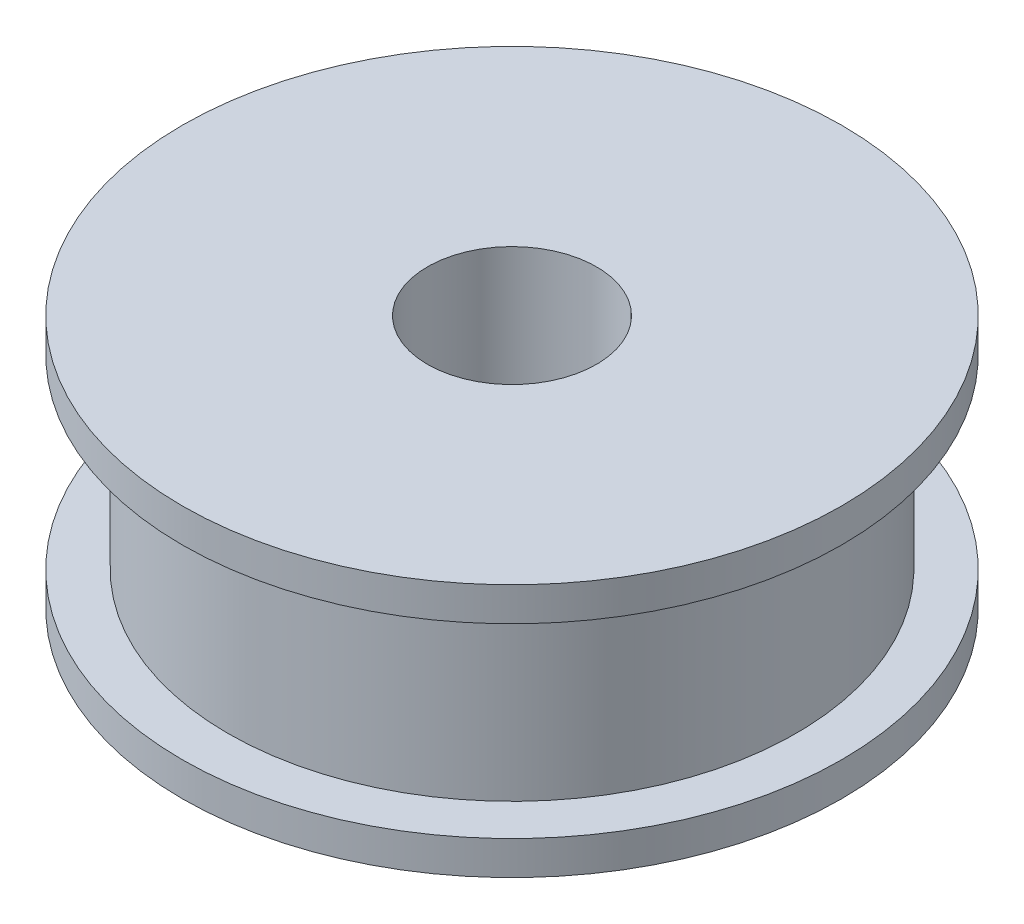
ISO-10303-21;
HEADER;
FILE_DESCRIPTION(('STEP AP214'),'2;1');
FILE_NAME('part.step','',(''),(''),'','','');
FILE_SCHEMA(('AUTOMOTIVE_DESIGN { 1 0 10303 214 1 1 1 1 }'));
ENDSEC;
DATA;
#1=APPLICATION_CONTEXT('core data for automotive mechanical design processes');
#2=APPLICATION_PROTOCOL_DEFINITION('international standard','automotive_design',2000,#1);
#3=PRODUCT_CONTEXT('',#1,'mechanical');
#4=PRODUCT('Part','Part','',(#3));
#5=PRODUCT_RELATED_PRODUCT_CATEGORY('part','',(#4));
#6=PRODUCT_DEFINITION_FORMATION('','',#4);
#7=PRODUCT_DEFINITION_CONTEXT('part definition',#1,'design');
#8=PRODUCT_DEFINITION('design','',#6,#7);
#9=PRODUCT_DEFINITION_SHAPE('','',#8);
#10=(LENGTH_UNIT() NAMED_UNIT(*) SI_UNIT(.MILLI.,.METRE.));
#11=(NAMED_UNIT(*) PLANE_ANGLE_UNIT() SI_UNIT($,.RADIAN.));
#12=(NAMED_UNIT(*) SI_UNIT($,.STERADIAN.) SOLID_ANGLE_UNIT());
#13=UNCERTAINTY_MEASURE_WITH_UNIT(LENGTH_MEASURE(1.E-05),#10,'distance_accuracy_value','');
#14=(GEOMETRIC_REPRESENTATION_CONTEXT(3) GLOBAL_UNCERTAINTY_ASSIGNED_CONTEXT((#13)) GLOBAL_UNIT_ASSIGNED_CONTEXT((#10,
#11,#12)) REPRESENTATION_CONTEXT('',''));
#15=CARTESIAN_POINT('',(0.,0.,0.));
#16=DIRECTION('',(0.,0.,1.));
#17=DIRECTION('',(1.,0.,0.));
#18=AXIS2_PLACEMENT_3D('',#15,#16,#17);
#19=CARTESIAN_POINT('',(0.,0.,0.));
#20=DIRECTION('',(0.,-1.,0.));
#21=DIRECTION('',(0.,0.,-1.));
#22=AXIS2_PLACEMENT_3D('',#19,#20,#21);
#23=PLANE('',#22);
#24=CARTESIAN_POINT('',(0.,0.,0.));
#25=DIRECTION('',(0.,1.,0.));
#26=DIRECTION('',(0.,0.,1.));
#27=AXIS2_PLACEMENT_3D('',#24,#25,#26);
#28=CIRCLE('',#27,5.);
#29=CARTESIAN_POINT('',(0.,0.,5.));
#30=VERTEX_POINT('',#29);
#31=EDGE_CURVE('E65',#30,#30,#28,.T.);
#32=ORIENTED_EDGE('',*,*,#31,.F.);
#33=EDGE_LOOP('',(#32));
#34=FACE_BOUND('',#33,.T.);
#35=CARTESIAN_POINT('',(0.,0.,0.));
#36=DIRECTION('',(0.,1.,0.));
#37=DIRECTION('',(0.,0.,1.));
#38=AXIS2_PLACEMENT_3D('',#35,#36,#37);
#39=CIRCLE('',#38,19.5);
#40=CARTESIAN_POINT('',(0.,0.,19.5));
#41=VERTEX_POINT('',#40);
#42=EDGE_CURVE('E10',#41,#41,#39,.T.);
#43=ORIENTED_EDGE('',*,*,#42,.T.);
#44=EDGE_LOOP('',(#43));
#45=FACE_BOUND('',#44,.T.);
#46=ADVANCED_FACE('F39',(#34,#45),#23,.F.);
#47=CARTESIAN_POINT('',(0.,23.5757575757576,0.));
#48=DIRECTION('',(0.,1.,0.));
#49=DIRECTION('',(0.,0.,1.));
#50=AXIS2_PLACEMENT_3D('',#47,#48,#49);
#51=CYLINDRICAL_SURFACE('',#50,19.5);
#52=ORIENTED_EDGE('',*,*,#42,.F.);
#53=EDGE_LOOP('',(#52));
#54=FACE_BOUND('',#53,.T.);
#55=CARTESIAN_POINT('',(0.,-2.,0.));
#56=DIRECTION('',(0.,1.,0.));
#57=DIRECTION('',(0.,0.,1.));
#58=AXIS2_PLACEMENT_3D('',#55,#56,#57);
#59=CIRCLE('',#58,19.5);
#60=CARTESIAN_POINT('',(0.,-2.,19.5));
#61=VERTEX_POINT('',#60);
#62=EDGE_CURVE('E45',#61,#61,#59,.T.);
#63=ORIENTED_EDGE('',*,*,#62,.T.);
#64=EDGE_LOOP('',(#63));
#65=FACE_BOUND('',#64,.T.);
#66=ADVANCED_FACE('F81',(#54,#65),#51,.T.);
#67=CARTESIAN_POINT('',(19.5,-2.,0.));
#68=DIRECTION('',(0.,1.,0.));
#69=DIRECTION('',(0.,0.,1.));
#70=AXIS2_PLACEMENT_3D('',#67,#68,#69);
#71=PLANE('',#70);
#72=ORIENTED_EDGE('',*,*,#62,.F.);
#73=EDGE_LOOP('',(#72));
#74=FACE_BOUND('',#73,.T.);
#75=CARTESIAN_POINT('',(0.,-2.,0.));
#76=DIRECTION('',(0.,1.,0.));
#77=DIRECTION('',(0.,0.,1.));
#78=AXIS2_PLACEMENT_3D('',#75,#76,#77);
#79=CIRCLE('',#78,16.805);
#80=CARTESIAN_POINT('',(0.,-2.,16.805));
#81=VERTEX_POINT('',#80);
#82=EDGE_CURVE('E49',#81,#81,#79,.T.);
#83=ORIENTED_EDGE('',*,*,#82,.T.);
#84=EDGE_LOOP('',(#83));
#85=FACE_BOUND('',#84,.T.);
#86=ADVANCED_FACE('F87',(#74,#85),#71,.F.);
#87=CARTESIAN_POINT('',(0.,23.5757575757576,0.));
#88=DIRECTION('',(0.,1.,0.));
#89=DIRECTION('',(0.,0.,1.));
#90=AXIS2_PLACEMENT_3D('',#87,#88,#89);
#91=CYLINDRICAL_SURFACE('',#90,16.805);
#92=ORIENTED_EDGE('',*,*,#82,.F.);
#93=EDGE_LOOP('',(#92));
#94=FACE_BOUND('',#93,.T.);
#95=CARTESIAN_POINT('',(0.,-13.,0.));
#96=DIRECTION('',(0.,1.,0.));
#97=DIRECTION('',(0.,0.,1.));
#98=AXIS2_PLACEMENT_3D('',#95,#96,#97);
#99=CIRCLE('',#98,16.805);
#100=CARTESIAN_POINT('',(0.,-13.,16.805));
#101=VERTEX_POINT('',#100);
#102=EDGE_CURVE('E53',#101,#101,#99,.T.);
#103=ORIENTED_EDGE('',*,*,#102,.T.);
#104=EDGE_LOOP('',(#103));
#105=FACE_BOUND('',#104,.T.);
#106=ADVANCED_FACE('F92',(#94,#105),#91,.T.);
#107=CARTESIAN_POINT('',(16.805,-13.,0.));
#108=DIRECTION('',(0.,-1.,0.));
#109=DIRECTION('',(0.,0.,-1.));
#110=AXIS2_PLACEMENT_3D('',#107,#108,#109);
#111=PLANE('',#110);
#112=ORIENTED_EDGE('',*,*,#102,.F.);
#113=EDGE_LOOP('',(#112));
#114=FACE_BOUND('',#113,.T.);
#115=CARTESIAN_POINT('',(0.,-13.,0.));
#116=DIRECTION('',(0.,1.,0.));
#117=DIRECTION('',(0.,0.,1.));
#118=AXIS2_PLACEMENT_3D('',#115,#116,#117);
#119=CIRCLE('',#118,19.5);
#120=CARTESIAN_POINT('',(0.,-13.,19.5));
#121=VERTEX_POINT('',#120);
#122=EDGE_CURVE('E58',#121,#121,#119,.T.);
#123=ORIENTED_EDGE('',*,*,#122,.T.);
#124=EDGE_LOOP('',(#123));
#125=FACE_BOUND('',#124,.T.);
#126=ADVANCED_FACE('F98',(#114,#125),#111,.F.);
#127=CARTESIAN_POINT('',(0.,23.5757575757576,0.));
#128=DIRECTION('',(0.,1.,0.));
#129=DIRECTION('',(0.,0.,1.));
#130=AXIS2_PLACEMENT_3D('',#127,#128,#129);
#131=CYLINDRICAL_SURFACE('',#130,19.5);
#132=ORIENTED_EDGE('',*,*,#122,.F.);
#133=EDGE_LOOP('',(#132));
#134=FACE_BOUND('',#133,.T.);
#135=CARTESIAN_POINT('',(0.,-15.,0.));
#136=DIRECTION('',(0.,1.,0.));
#137=DIRECTION('',(0.,0.,1.));
#138=AXIS2_PLACEMENT_3D('',#135,#136,#137);
#139=CIRCLE('',#138,19.5);
#140=CARTESIAN_POINT('',(0.,-15.,19.5));
#141=VERTEX_POINT('',#140);
#142=EDGE_CURVE('E61',#141,#141,#139,.T.);
#143=ORIENTED_EDGE('',*,*,#142,.T.);
#144=EDGE_LOOP('',(#143));
#145=FACE_BOUND('',#144,.T.);
#146=ADVANCED_FACE('F102',(#134,#145),#131,.T.);
#147=CARTESIAN_POINT('',(19.5,-15.,0.));
#148=DIRECTION('',(0.,1.,0.));
#149=DIRECTION('',(0.,0.,1.));
#150=AXIS2_PLACEMENT_3D('',#147,#148,#149);
#151=PLANE('',#150);
#152=CARTESIAN_POINT('',(0.,-15.,0.));
#153=DIRECTION('',(0.,1.,0.));
#154=DIRECTION('',(0.,0.,1.));
#155=AXIS2_PLACEMENT_3D('',#152,#153,#154);
#156=CIRCLE('',#155,5.);
#157=CARTESIAN_POINT('',(0.,-15.,5.));
#158=VERTEX_POINT('',#157);
#159=EDGE_CURVE('E64',#158,#158,#156,.T.);
#160=ORIENTED_EDGE('',*,*,#159,.T.);
#161=EDGE_LOOP('',(#160));
#162=FACE_BOUND('',#161,.T.);
#163=ORIENTED_EDGE('',*,*,#142,.F.);
#164=EDGE_LOOP('',(#163));
#165=FACE_BOUND('',#164,.T.);
#166=ADVANCED_FACE('F71',(#162,#165),#151,.F.);
#167=CARTESIAN_POINT('',(0.,-15.,0.));
#168=DIRECTION('',(0.,1.,0.));
#169=DIRECTION('',(0.,0.,1.));
#170=AXIS2_PLACEMENT_3D('',#167,#168,#169);
#171=CYLINDRICAL_SURFACE('',#170,5.);
#172=ORIENTED_EDGE('',*,*,#159,.F.);
#173=EDGE_LOOP('',(#172));
#174=FACE_BOUND('',#173,.T.);
#175=ORIENTED_EDGE('',*,*,#31,.T.);
#176=EDGE_LOOP('',(#175));
#177=FACE_BOUND('',#176,.T.);
#178=ADVANCED_FACE('F74',(#174,#177),#171,.F.);
#179=CLOSED_SHELL('',(#46,#66,#86,#106,#126,#146,#166,#178));
#180=MANIFOLD_SOLID_BREP('B2',#179);
#181=ADVANCED_BREP_SHAPE_REPRESENTATION('',(#18,#180),#14);
#182=SHAPE_DEFINITION_REPRESENTATION(#9,#181);
ENDSEC;
END-ISO-10303-21;
